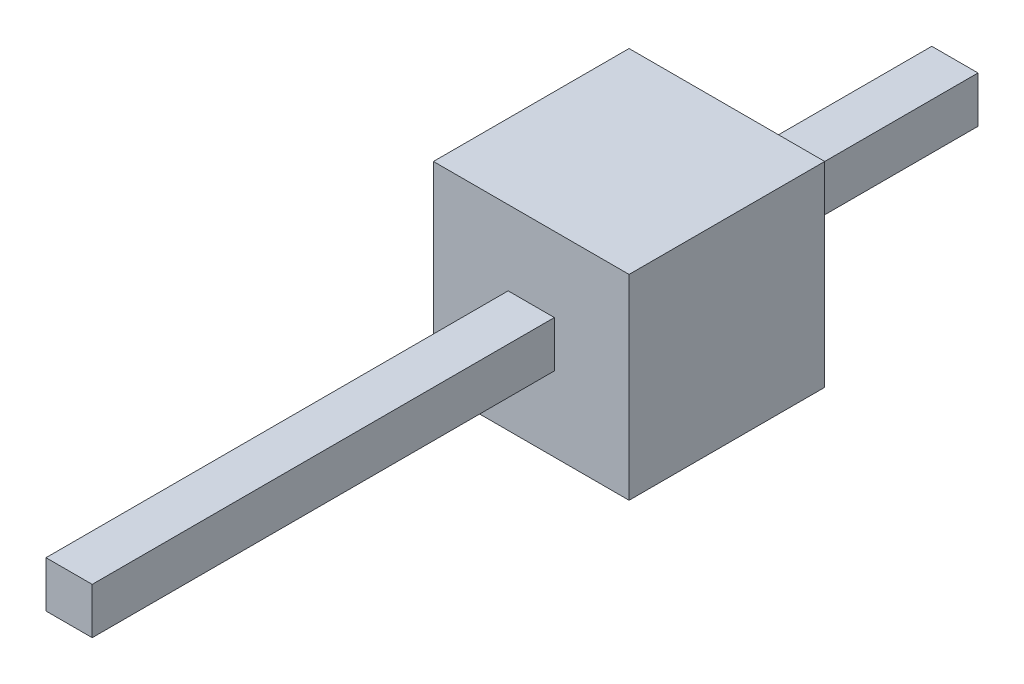
ISO-10303-21;
HEADER;
FILE_DESCRIPTION(('STEP AP214'),'2;1');
FILE_NAME('part.step','',(''),(''),'','','');
FILE_SCHEMA(('AUTOMOTIVE_DESIGN { 1 0 10303 214 1 1 1 1 }'));
ENDSEC;
DATA;
#1=APPLICATION_CONTEXT('core data for automotive mechanical design processes');
#2=APPLICATION_PROTOCOL_DEFINITION('international standard','automotive_design',2000,#1);
#3=PRODUCT_CONTEXT('',#1,'mechanical');
#4=PRODUCT('Part','Part','',(#3));
#5=PRODUCT_RELATED_PRODUCT_CATEGORY('part','',(#4));
#6=PRODUCT_DEFINITION_FORMATION('','',#4);
#7=PRODUCT_DEFINITION_CONTEXT('part definition',#1,'design');
#8=PRODUCT_DEFINITION('design','',#6,#7);
#9=PRODUCT_DEFINITION_SHAPE('','',#8);
#10=(LENGTH_UNIT() NAMED_UNIT(*) SI_UNIT(.MILLI.,.METRE.));
#11=(NAMED_UNIT(*) PLANE_ANGLE_UNIT() SI_UNIT($,.RADIAN.));
#12=(NAMED_UNIT(*) SI_UNIT($,.STERADIAN.) SOLID_ANGLE_UNIT());
#13=UNCERTAINTY_MEASURE_WITH_UNIT(LENGTH_MEASURE(1.E-05),#10,'distance_accuracy_value','');
#14=(GEOMETRIC_REPRESENTATION_CONTEXT(3) GLOBAL_UNCERTAINTY_ASSIGNED_CONTEXT((#13)) GLOBAL_UNIT_ASSIGNED_CONTEXT((#10,
#11,#12)) REPRESENTATION_CONTEXT('',''));
#15=CARTESIAN_POINT('',(0.,0.,0.));
#16=DIRECTION('',(0.,0.,1.));
#17=DIRECTION('',(1.,0.,0.));
#18=AXIS2_PLACEMENT_3D('',#15,#16,#17);
#19=CARTESIAN_POINT('',(0.,0.,2.54));
#20=DIRECTION('',(0.,0.,1.));
#21=DIRECTION('',(1.,0.,0.));
#22=AXIS2_PLACEMENT_3D('',#19,#20,#21);
#23=PLANE('',#22);
#24=DIRECTION('',(0.,-1.,0.));
#25=VECTOR('',#24,1.);
#26=CARTESIAN_POINT('',(-1.27,-1.27,2.54));
#27=LINE('',#26,#25);
#28=CARTESIAN_POINT('',(-1.27,1.27,2.54));
#29=VERTEX_POINT('',#28);
#30=CARTESIAN_POINT('',(-1.27,-1.27,2.54));
#31=VERTEX_POINT('',#30);
#32=EDGE_CURVE('E231',#29,#31,#27,.T.);
#33=ORIENTED_EDGE('',*,*,#32,.T.);
#34=DIRECTION('',(1.,0.,0.));
#35=VECTOR('',#34,1.);
#36=CARTESIAN_POINT('',(1.27,-1.27,2.54));
#37=LINE('',#36,#35);
#38=CARTESIAN_POINT('',(1.27,-1.27,2.54));
#39=VERTEX_POINT('',#38);
#40=EDGE_CURVE('E92',#31,#39,#37,.T.);
#41=ORIENTED_EDGE('',*,*,#40,.T.);
#42=DIRECTION('',(0.,1.,0.));
#43=VECTOR('',#42,1.);
#44=CARTESIAN_POINT('',(1.27,-1.27,2.54));
#45=LINE('',#44,#43);
#46=CARTESIAN_POINT('',(1.27,1.27,2.54));
#47=VERTEX_POINT('',#46);
#48=EDGE_CURVE('E236',#39,#47,#45,.T.);
#49=ORIENTED_EDGE('',*,*,#48,.T.);
#50=DIRECTION('',(-1.,0.,0.));
#51=VECTOR('',#50,1.);
#52=CARTESIAN_POINT('',(1.27,1.27,2.54));
#53=LINE('',#52,#51);
#54=EDGE_CURVE('E64',#47,#29,#53,.T.);
#55=ORIENTED_EDGE('',*,*,#54,.T.);
#56=EDGE_LOOP('',(#33,#41,#49,#55));
#57=FACE_BOUND('',#56,.T.);
#58=DIRECTION('',(1.,0.,0.));
#59=VECTOR('',#58,1.);
#60=CARTESIAN_POINT('',(0.3,-0.3,2.54));
#61=LINE('',#60,#59);
#62=CARTESIAN_POINT('',(-0.3,-0.3,2.54));
#63=VERTEX_POINT('',#62);
#64=CARTESIAN_POINT('',(0.3,-0.3,2.54));
#65=VERTEX_POINT('',#64);
#66=EDGE_CURVE('E206',#63,#65,#61,.T.);
#67=ORIENTED_EDGE('',*,*,#66,.F.);
#68=DIRECTION('',(0.,-1.,0.));
#69=VECTOR('',#68,1.);
#70=CARTESIAN_POINT('',(-0.3,-0.3,2.54));
#71=LINE('',#70,#69);
#72=CARTESIAN_POINT('',(-0.3,0.3,2.54));
#73=VERTEX_POINT('',#72);
#74=EDGE_CURVE('E203',#73,#63,#71,.T.);
#75=ORIENTED_EDGE('',*,*,#74,.F.);
#76=DIRECTION('',(-1.,0.,0.));
#77=VECTOR('',#76,1.);
#78=CARTESIAN_POINT('',(0.3,0.3,2.54));
#79=LINE('',#78,#77);
#80=CARTESIAN_POINT('',(0.3,0.3,2.54));
#81=VERTEX_POINT('',#80);
#82=EDGE_CURVE('E55',#81,#73,#79,.T.);
#83=ORIENTED_EDGE('',*,*,#82,.F.);
#84=DIRECTION('',(0.,1.,0.));
#85=VECTOR('',#84,1.);
#86=CARTESIAN_POINT('',(0.3,-0.3,2.54));
#87=LINE('',#86,#85);
#88=EDGE_CURVE('E211',#65,#81,#87,.T.);
#89=ORIENTED_EDGE('',*,*,#88,.F.);
#90=EDGE_LOOP('',(#67,#75,#83,#89));
#91=FACE_BOUND('',#90,.T.);
#92=ADVANCED_FACE('F39',(#57,#91),#23,.T.);
#93=CARTESIAN_POINT('',(0.,0.,0.));
#94=DIRECTION('',(0.,0.,1.));
#95=DIRECTION('',(1.,0.,0.));
#96=AXIS2_PLACEMENT_3D('',#93,#94,#95);
#97=PLANE('',#96);
#98=DIRECTION('',(0.,-1.,0.));
#99=VECTOR('',#98,1.);
#100=CARTESIAN_POINT('',(-1.27,-1.27,0.));
#101=LINE('',#100,#99);
#102=CARTESIAN_POINT('',(-1.27,1.27,0.));
#103=VERTEX_POINT('',#102);
#104=CARTESIAN_POINT('',(-1.27,-1.27,0.));
#105=VERTEX_POINT('',#104);
#106=EDGE_CURVE('E216',#103,#105,#101,.T.);
#107=ORIENTED_EDGE('',*,*,#106,.F.);
#108=DIRECTION('',(-1.,0.,0.));
#109=VECTOR('',#108,1.);
#110=CARTESIAN_POINT('',(1.27,1.27,0.));
#111=LINE('',#110,#109);
#112=CARTESIAN_POINT('',(1.27,1.27,0.));
#113=VERTEX_POINT('',#112);
#114=EDGE_CURVE('E85',#113,#103,#111,.T.);
#115=ORIENTED_EDGE('',*,*,#114,.F.);
#116=DIRECTION('',(0.,1.,0.));
#117=VECTOR('',#116,1.);
#118=CARTESIAN_POINT('',(1.27,-1.27,0.));
#119=LINE('',#118,#117);
#120=CARTESIAN_POINT('',(1.27,-1.27,0.));
#121=VERTEX_POINT('',#120);
#122=EDGE_CURVE('E248',#121,#113,#119,.T.);
#123=ORIENTED_EDGE('',*,*,#122,.F.);
#124=DIRECTION('',(1.,0.,0.));
#125=VECTOR('',#124,1.);
#126=CARTESIAN_POINT('',(1.27,-1.27,0.));
#127=LINE('',#126,#125);
#128=EDGE_CURVE('E245',#105,#121,#127,.T.);
#129=ORIENTED_EDGE('',*,*,#128,.F.);
#130=EDGE_LOOP('',(#107,#115,#123,#129));
#131=FACE_BOUND('',#130,.T.);
#132=DIRECTION('',(0.,-1.,0.));
#133=VECTOR('',#132,1.);
#134=CARTESIAN_POINT('',(-0.3,-0.3,0.));
#135=LINE('',#134,#133);
#136=CARTESIAN_POINT('',(-0.3,0.3,0.));
#137=VERTEX_POINT('',#136);
#138=CARTESIAN_POINT('',(-0.3,-0.3,0.));
#139=VERTEX_POINT('',#138);
#140=EDGE_CURVE('E191',#137,#139,#135,.T.);
#141=ORIENTED_EDGE('',*,*,#140,.T.);
#142=DIRECTION('',(1.,0.,0.));
#143=VECTOR('',#142,1.);
#144=CARTESIAN_POINT('',(0.3,-0.3,0.));
#145=LINE('',#144,#143);
#146=CARTESIAN_POINT('',(0.3,-0.3,0.));
#147=VERTEX_POINT('',#146);
#148=EDGE_CURVE('E220',#139,#147,#145,.T.);
#149=ORIENTED_EDGE('',*,*,#148,.T.);
#150=DIRECTION('',(0.,1.,0.));
#151=VECTOR('',#150,1.);
#152=CARTESIAN_POINT('',(0.3,-0.3,0.));
#153=LINE('',#152,#151);
#154=CARTESIAN_POINT('',(0.3,0.3,0.));
#155=VERTEX_POINT('',#154);
#156=EDGE_CURVE('E224',#147,#155,#153,.T.);
#157=ORIENTED_EDGE('',*,*,#156,.T.);
#158=DIRECTION('',(-1.,0.,0.));
#159=VECTOR('',#158,1.);
#160=CARTESIAN_POINT('',(0.3,0.3,0.));
#161=LINE('',#160,#159);
#162=EDGE_CURVE('E207',#155,#137,#161,.T.);
#163=ORIENTED_EDGE('',*,*,#162,.T.);
#164=EDGE_LOOP('',(#141,#149,#157,#163));
#165=FACE_BOUND('',#164,.T.);
#166=ADVANCED_FACE('F266',(#131,#165),#97,.F.);
#167=CARTESIAN_POINT('',(-1.27,-1.27,2.54));
#168=DIRECTION('',(1.,0.,0.));
#169=DIRECTION('',(0.,0.,-1.));
#170=AXIS2_PLACEMENT_3D('',#167,#168,#169);
#171=PLANE('',#170);
#172=ORIENTED_EDGE('',*,*,#106,.T.);
#173=DIRECTION('',(0.,0.,-1.));
#174=VECTOR('',#173,1.);
#175=CARTESIAN_POINT('',(-1.27,-1.27,2.54));
#176=LINE('',#175,#174);
#177=EDGE_CURVE('E11',#31,#105,#176,.T.);
#178=ORIENTED_EDGE('',*,*,#177,.F.);
#179=ORIENTED_EDGE('',*,*,#32,.F.);
#180=DIRECTION('',(0.,0.,-1.));
#181=VECTOR('',#180,1.);
#182=CARTESIAN_POINT('',(-1.27,1.27,2.54));
#183=LINE('',#182,#181);
#184=EDGE_CURVE('E241',#29,#103,#183,.T.);
#185=ORIENTED_EDGE('',*,*,#184,.T.);
#186=EDGE_LOOP('',(#172,#178,#179,#185));
#187=FACE_BOUND('',#186,.T.);
#188=ADVANCED_FACE('F41',(#187),#171,.F.);
#189=CARTESIAN_POINT('',(1.27,-1.27,2.54));
#190=DIRECTION('',(0.,1.,0.));
#191=DIRECTION('',(-1.,0.,0.));
#192=AXIS2_PLACEMENT_3D('',#189,#190,#191);
#193=PLANE('',#192);
#194=ORIENTED_EDGE('',*,*,#128,.T.);
#195=DIRECTION('',(0.,0.,-1.));
#196=VECTOR('',#195,1.);
#197=CARTESIAN_POINT('',(1.27,-1.27,2.54));
#198=LINE('',#197,#196);
#199=EDGE_CURVE('E48',#39,#121,#198,.T.);
#200=ORIENTED_EDGE('',*,*,#199,.F.);
#201=ORIENTED_EDGE('',*,*,#40,.F.);
#202=ORIENTED_EDGE('',*,*,#177,.T.);
#203=EDGE_LOOP('',(#194,#200,#201,#202));
#204=FACE_BOUND('',#203,.T.);
#205=ADVANCED_FACE('F282',(#204),#193,.F.);
#206=CARTESIAN_POINT('',(1.27,-1.27,2.54));
#207=DIRECTION('',(-1.,0.,0.));
#208=DIRECTION('',(0.,0.,1.));
#209=AXIS2_PLACEMENT_3D('',#206,#207,#208);
#210=PLANE('',#209);
#211=ORIENTED_EDGE('',*,*,#122,.T.);
#212=DIRECTION('',(0.,0.,-1.));
#213=VECTOR('',#212,1.);
#214=CARTESIAN_POINT('',(1.27,1.27,2.54));
#215=LINE('',#214,#213);
#216=EDGE_CURVE('E255',#47,#113,#215,.T.);
#217=ORIENTED_EDGE('',*,*,#216,.F.);
#218=ORIENTED_EDGE('',*,*,#48,.F.);
#219=ORIENTED_EDGE('',*,*,#199,.T.);
#220=EDGE_LOOP('',(#211,#217,#218,#219));
#221=FACE_BOUND('',#220,.T.);
#222=ADVANCED_FACE('F262',(#221),#210,.F.);
#223=CARTESIAN_POINT('',(1.27,1.27,2.54));
#224=DIRECTION('',(0.,-1.,0.));
#225=DIRECTION('',(1.,0.,0.));
#226=AXIS2_PLACEMENT_3D('',#223,#224,#225);
#227=PLANE('',#226);
#228=ORIENTED_EDGE('',*,*,#114,.T.);
#229=ORIENTED_EDGE('',*,*,#184,.F.);
#230=ORIENTED_EDGE('',*,*,#54,.F.);
#231=ORIENTED_EDGE('',*,*,#216,.T.);
#232=EDGE_LOOP('',(#228,#229,#230,#231));
#233=FACE_BOUND('',#232,.T.);
#234=ADVANCED_FACE('F271',(#233),#227,.F.);
#235=CARTESIAN_POINT('',(0.,0.,-2.96));
#236=DIRECTION('',(0.,0.,1.));
#237=DIRECTION('',(1.,0.,0.));
#238=AXIS2_PLACEMENT_3D('',#235,#236,#237);
#239=PLANE('',#238);
#240=DIRECTION('',(-1.,0.,0.));
#241=VECTOR('',#240,1.);
#242=CARTESIAN_POINT('',(0.3,0.3,-2.96));
#243=LINE('',#242,#241);
#244=CARTESIAN_POINT('',(0.3,0.3,-2.96));
#245=VERTEX_POINT('',#244);
#246=CARTESIAN_POINT('',(-0.3,0.3,-2.96));
#247=VERTEX_POINT('',#246);
#248=EDGE_CURVE('E172',#245,#247,#243,.T.);
#249=ORIENTED_EDGE('',*,*,#248,.F.);
#250=DIRECTION('',(0.,1.,0.));
#251=VECTOR('',#250,1.);
#252=CARTESIAN_POINT('',(0.3,-0.3,-2.96));
#253=LINE('',#252,#251);
#254=CARTESIAN_POINT('',(0.3,-0.3,-2.96));
#255=VERTEX_POINT('',#254);
#256=EDGE_CURVE('E148',#255,#245,#253,.T.);
#257=ORIENTED_EDGE('',*,*,#256,.F.);
#258=DIRECTION('',(1.,0.,0.));
#259=VECTOR('',#258,1.);
#260=CARTESIAN_POINT('',(-0.3,-0.3,-2.96));
#261=LINE('',#260,#259);
#262=CARTESIAN_POINT('',(-0.3,-0.3,-2.96));
#263=VERTEX_POINT('',#262);
#264=EDGE_CURVE('E180',#263,#255,#261,.T.);
#265=ORIENTED_EDGE('',*,*,#264,.F.);
#266=DIRECTION('',(0.,-1.,0.));
#267=VECTOR('',#266,1.);
#268=CARTESIAN_POINT('',(-0.3,0.3,-2.96));
#269=LINE('',#268,#267);
#270=EDGE_CURVE('E176',#247,#263,#269,.T.);
#271=ORIENTED_EDGE('',*,*,#270,.F.);
#272=EDGE_LOOP('',(#249,#257,#265,#271));
#273=FACE_BOUND('',#272,.T.);
#274=ADVANCED_FACE('F273',(#273),#239,.F.);
#275=CARTESIAN_POINT('',(-0.3,0.3,-2.96));
#276=DIRECTION('',(-1.,0.,0.));
#277=DIRECTION('',(0.,0.,1.));
#278=AXIS2_PLACEMENT_3D('',#275,#276,#277);
#279=PLANE('',#278);
#280=ORIENTED_EDGE('',*,*,#140,.F.);
#281=DIRECTION('',(0.,0.,1.));
#282=VECTOR('',#281,1.);
#283=CARTESIAN_POINT('',(-0.3,0.3,-2.96));
#284=LINE('',#283,#282);
#285=EDGE_CURVE('E147',#247,#137,#284,.T.);
#286=ORIENTED_EDGE('',*,*,#285,.F.);
#287=ORIENTED_EDGE('',*,*,#270,.T.);
#288=DIRECTION('',(0.,0.,1.));
#289=VECTOR('',#288,1.);
#290=CARTESIAN_POINT('',(-0.3,-0.3,-2.96));
#291=LINE('',#290,#289);
#292=EDGE_CURVE('E198',#263,#139,#291,.T.);
#293=ORIENTED_EDGE('',*,*,#292,.T.);
#294=EDGE_LOOP('',(#280,#286,#287,#293));
#295=FACE_BOUND('',#294,.T.);
#296=ADVANCED_FACE('F279',(#295),#279,.T.);
#297=CARTESIAN_POINT('',(-0.3,-0.3,-2.96));
#298=DIRECTION('',(0.,-1.,0.));
#299=DIRECTION('',(0.,0.,-1.));
#300=AXIS2_PLACEMENT_3D('',#297,#298,#299);
#301=PLANE('',#300);
#302=ORIENTED_EDGE('',*,*,#148,.F.);
#303=ORIENTED_EDGE('',*,*,#292,.F.);
#304=ORIENTED_EDGE('',*,*,#264,.T.);
#305=DIRECTION('',(0.,0.,1.));
#306=VECTOR('',#305,1.);
#307=CARTESIAN_POINT('',(0.3,-0.3,-2.96));
#308=LINE('',#307,#306);
#309=EDGE_CURVE('E193',#255,#147,#308,.T.);
#310=ORIENTED_EDGE('',*,*,#309,.T.);
#311=EDGE_LOOP('',(#302,#303,#304,#310));
#312=FACE_BOUND('',#311,.T.);
#313=ADVANCED_FACE('F301',(#312),#301,.T.);
#314=CARTESIAN_POINT('',(0.3,-0.3,-2.96));
#315=DIRECTION('',(1.,0.,0.));
#316=DIRECTION('',(0.,0.,-1.));
#317=AXIS2_PLACEMENT_3D('',#314,#315,#316);
#318=PLANE('',#317);
#319=ORIENTED_EDGE('',*,*,#156,.F.);
#320=ORIENTED_EDGE('',*,*,#309,.F.);
#321=ORIENTED_EDGE('',*,*,#256,.T.);
#322=DIRECTION('',(0.,0.,1.));
#323=VECTOR('',#322,1.);
#324=CARTESIAN_POINT('',(0.3,0.3,-2.96));
#325=LINE('',#324,#323);
#326=EDGE_CURVE('E187',#245,#155,#325,.T.);
#327=ORIENTED_EDGE('',*,*,#326,.T.);
#328=EDGE_LOOP('',(#319,#320,#321,#327));
#329=FACE_BOUND('',#328,.T.);
#330=ADVANCED_FACE('F304',(#329),#318,.T.);
#331=CARTESIAN_POINT('',(0.3,0.3,-2.96));
#332=DIRECTION('',(0.,1.,0.));
#333=DIRECTION('',(0.,0.,1.));
#334=AXIS2_PLACEMENT_3D('',#331,#332,#333);
#335=PLANE('',#334);
#336=ORIENTED_EDGE('',*,*,#162,.F.);
#337=ORIENTED_EDGE('',*,*,#326,.F.);
#338=ORIENTED_EDGE('',*,*,#248,.T.);
#339=ORIENTED_EDGE('',*,*,#285,.T.);
#340=EDGE_LOOP('',(#336,#337,#338,#339));
#341=FACE_BOUND('',#340,.T.);
#342=ADVANCED_FACE('F294',(#341),#335,.T.);
#343=CARTESIAN_POINT('',(0.3,0.3,8.54));
#344=VERTEX_POINT('',#343);
#345=EDGE_CURVE('E192',#81,#344,#325,.T.);
#346=ORIENTED_EDGE('',*,*,#345,.F.);
#347=ORIENTED_EDGE('',*,*,#82,.T.);
#348=CARTESIAN_POINT('',(-0.3,0.3,8.54));
#349=VERTEX_POINT('',#348);
#350=EDGE_CURVE('E138',#73,#349,#284,.T.);
#351=ORIENTED_EDGE('',*,*,#350,.T.);
#352=DIRECTION('',(-1.,0.,0.));
#353=VECTOR('',#352,1.);
#354=CARTESIAN_POINT('',(0.3,0.3,8.54));
#355=LINE('',#354,#353);
#356=EDGE_CURVE('E143',#344,#349,#355,.T.);
#357=ORIENTED_EDGE('',*,*,#356,.F.);
#358=EDGE_LOOP('',(#346,#347,#351,#357));
#359=FACE_BOUND('',#358,.T.);
#360=ADVANCED_FACE('F141',(#359),#335,.T.);
#361=CARTESIAN_POINT('',(0.3,-0.3,8.54));
#362=VERTEX_POINT('',#361);
#363=EDGE_CURVE('E197',#65,#362,#308,.T.);
#364=ORIENTED_EDGE('',*,*,#363,.F.);
#365=ORIENTED_EDGE('',*,*,#88,.T.);
#366=ORIENTED_EDGE('',*,*,#345,.T.);
#367=DIRECTION('',(0.,1.,0.));
#368=VECTOR('',#367,1.);
#369=CARTESIAN_POINT('',(0.3,-0.3,8.54));
#370=LINE('',#369,#368);
#371=EDGE_CURVE('E164',#362,#344,#370,.T.);
#372=ORIENTED_EDGE('',*,*,#371,.F.);
#373=EDGE_LOOP('',(#364,#365,#366,#372));
#374=FACE_BOUND('',#373,.T.);
#375=ADVANCED_FACE('F293',(#374),#318,.T.);
#376=CARTESIAN_POINT('',(-0.3,-0.3,8.54));
#377=VERTEX_POINT('',#376);
#378=EDGE_CURVE('E154',#63,#377,#291,.T.);
#379=ORIENTED_EDGE('',*,*,#378,.F.);
#380=ORIENTED_EDGE('',*,*,#66,.T.);
#381=ORIENTED_EDGE('',*,*,#363,.T.);
#382=DIRECTION('',(1.,0.,0.));
#383=VECTOR('',#382,1.);
#384=CARTESIAN_POINT('',(-0.3,-0.3,8.54));
#385=LINE('',#384,#383);
#386=EDGE_CURVE('E159',#377,#362,#385,.T.);
#387=ORIENTED_EDGE('',*,*,#386,.F.);
#388=EDGE_LOOP('',(#379,#380,#381,#387));
#389=FACE_BOUND('',#388,.T.);
#390=ADVANCED_FACE('F297',(#389),#301,.T.);
#391=ORIENTED_EDGE('',*,*,#350,.F.);
#392=ORIENTED_EDGE('',*,*,#74,.T.);
#393=ORIENTED_EDGE('',*,*,#378,.T.);
#394=DIRECTION('',(0.,-1.,0.));
#395=VECTOR('',#394,1.);
#396=CARTESIAN_POINT('',(-0.3,0.3,8.54));
#397=LINE('',#396,#395);
#398=EDGE_CURVE('E151',#349,#377,#397,.T.);
#399=ORIENTED_EDGE('',*,*,#398,.F.);
#400=EDGE_LOOP('',(#391,#392,#393,#399));
#401=FACE_BOUND('',#400,.T.);
#402=ADVANCED_FACE('F152',(#401),#279,.T.);
#403=CARTESIAN_POINT('',(0.,0.,8.54));
#404=DIRECTION('',(0.,0.,1.));
#405=DIRECTION('',(1.,0.,0.));
#406=AXIS2_PLACEMENT_3D('',#403,#404,#405);
#407=PLANE('',#406);
#408=ORIENTED_EDGE('',*,*,#356,.T.);
#409=ORIENTED_EDGE('',*,*,#398,.T.);
#410=ORIENTED_EDGE('',*,*,#386,.T.);
#411=ORIENTED_EDGE('',*,*,#371,.T.);
#412=EDGE_LOOP('',(#408,#409,#410,#411));
#413=FACE_BOUND('',#412,.T.);
#414=ADVANCED_FACE('F162',(#413),#407,.T.);
#415=CLOSED_SHELL('',(#92,#166,#188,#205,#222,#234,#274,#296,#313,#330,#342,#360,#375,#390,#402,#414));
#416=MANIFOLD_SOLID_BREP('B2',#415);
#417=ADVANCED_BREP_SHAPE_REPRESENTATION('',(#18,#416),#14);
#418=SHAPE_DEFINITION_REPRESENTATION(#9,#417);
ENDSEC;
END-ISO-10303-21;
